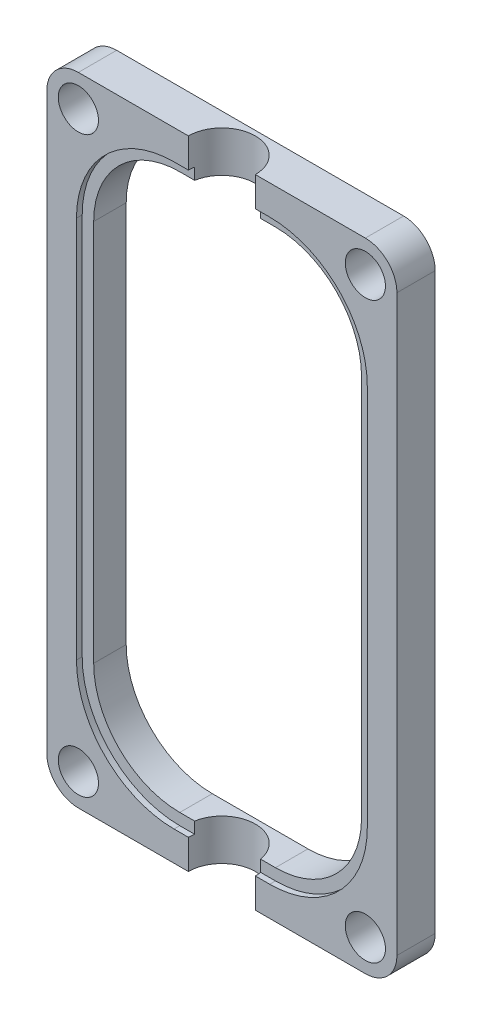
ISO-10303-21;
HEADER;
FILE_DESCRIPTION(('STEP AP214'),'2;1');
FILE_NAME('part.step','',(''),(''),'','','');
FILE_SCHEMA(('AUTOMOTIVE_DESIGN { 1 0 10303 214 1 1 1 1 }'));
ENDSEC;
DATA;
#1=APPLICATION_CONTEXT('core data for automotive mechanical design processes');
#2=APPLICATION_PROTOCOL_DEFINITION('international standard','automotive_design',2000,#1);
#3=PRODUCT_CONTEXT('',#1,'mechanical');
#4=PRODUCT('Part','Part','',(#3));
#5=PRODUCT_RELATED_PRODUCT_CATEGORY('part','',(#4));
#6=PRODUCT_DEFINITION_FORMATION('','',#4);
#7=PRODUCT_DEFINITION_CONTEXT('part definition',#1,'design');
#8=PRODUCT_DEFINITION('design','',#6,#7);
#9=PRODUCT_DEFINITION_SHAPE('','',#8);
#10=(LENGTH_UNIT() NAMED_UNIT(*) SI_UNIT(.MILLI.,.METRE.));
#11=(NAMED_UNIT(*) PLANE_ANGLE_UNIT() SI_UNIT($,.RADIAN.));
#12=(NAMED_UNIT(*) SI_UNIT($,.STERADIAN.) SOLID_ANGLE_UNIT());
#13=UNCERTAINTY_MEASURE_WITH_UNIT(LENGTH_MEASURE(1.E-05),#10,'distance_accuracy_value','');
#14=(GEOMETRIC_REPRESENTATION_CONTEXT(3) GLOBAL_UNCERTAINTY_ASSIGNED_CONTEXT((#13)) GLOBAL_UNIT_ASSIGNED_CONTEXT((#10,
#11,#12)) REPRESENTATION_CONTEXT('',''));
#15=CARTESIAN_POINT('',(0.,0.,0.));
#16=DIRECTION('',(0.,0.,1.));
#17=DIRECTION('',(1.,0.,0.));
#18=AXIS2_PLACEMENT_3D('',#15,#16,#17);
#19=CARTESIAN_POINT('',(-7.5,-15.,2.));
#20=DIRECTION('',(0.,0.,1.));
#21=DIRECTION('',(1.,0.,0.));
#22=AXIS2_PLACEMENT_3D('',#19,#20,#21);
#23=PLANE('',#22);
#24=CARTESIAN_POINT('',(7.5,-15.,2.));
#25=DIRECTION('',(0.,0.,1.));
#26=DIRECTION('',(1.,0.,0.));
#27=AXIS2_PLACEMENT_3D('',#24,#25,#26);
#28=CIRCLE('',#27,1.05);
#29=CARTESIAN_POINT('',(8.55,-15.,2.));
#30=VERTEX_POINT('',#29);
#31=EDGE_CURVE('E441',#30,#30,#28,.T.);
#32=ORIENTED_EDGE('',*,*,#31,.F.);
#33=EDGE_LOOP('',(#32));
#34=FACE_BOUND('',#33,.T.);
#35=CARTESIAN_POINT('',(7.5,15.,2.));
#36=DIRECTION('',(0.,0.,1.));
#37=DIRECTION('',(1.,0.,0.));
#38=AXIS2_PLACEMENT_3D('',#35,#36,#37);
#39=CIRCLE('',#38,1.05);
#40=CARTESIAN_POINT('',(8.55,15.,2.));
#41=VERTEX_POINT('',#40);
#42=EDGE_CURVE('E450',#41,#41,#39,.T.);
#43=ORIENTED_EDGE('',*,*,#42,.F.);
#44=EDGE_LOOP('',(#43));
#45=FACE_BOUND('',#44,.T.);
#46=DIRECTION('',(-1.,0.,0.));
#47=VECTOR('',#46,1.);
#48=CARTESIAN_POINT('',(7.5,16.65,2.));
#49=LINE('',#48,#47);
#50=CARTESIAN_POINT('',(7.5,16.65,2.));
#51=VERTEX_POINT('',#50);
#52=CARTESIAN_POINT('',(1.75,16.65,2.));
#53=VERTEX_POINT('',#52);
#54=EDGE_CURVE('E285',#51,#53,#49,.T.);
#55=ORIENTED_EDGE('',*,*,#54,.T.);
#56=DIRECTION('',(0.,-1.,0.));
#57=VECTOR('',#56,1.);
#58=CARTESIAN_POINT('',(1.75,20.5631189606246,2.));
#59=LINE('',#58,#57);
#60=CARTESIAN_POINT('',(1.75,15.1,2.));
#61=VERTEX_POINT('',#60);
#62=EDGE_CURVE('E262',#53,#61,#59,.T.);
#63=ORIENTED_EDGE('',*,*,#62,.T.);
#64=DIRECTION('',(-1.,0.,0.));
#65=VECTOR('',#64,1.);
#66=CARTESIAN_POINT('',(2.5,15.1,2.));
#67=LINE('',#66,#65);
#68=CARTESIAN_POINT('',(2.5,15.1,2.));
#69=VERTEX_POINT('',#68);
#70=EDGE_CURVE('E395',#69,#61,#67,.T.);
#71=ORIENTED_EDGE('',*,*,#70,.F.);
#72=CARTESIAN_POINT('',(2.5,10.,2.));
#73=DIRECTION('',(0.,0.,1.));
#74=DIRECTION('',(1.,0.,0.));
#75=AXIS2_PLACEMENT_3D('',#72,#73,#74);
#76=CIRCLE('',#75,5.1);
#77=CARTESIAN_POINT('',(7.6,10.,2.));
#78=VERTEX_POINT('',#77);
#79=EDGE_CURVE('E391',#78,#69,#76,.T.);
#80=ORIENTED_EDGE('',*,*,#79,.F.);
#81=DIRECTION('',(0.,1.,0.));
#82=VECTOR('',#81,1.);
#83=CARTESIAN_POINT('',(7.6,-10.,2.));
#84=LINE('',#83,#82);
#85=CARTESIAN_POINT('',(7.6,-10.,2.));
#86=VERTEX_POINT('',#85);
#87=EDGE_CURVE('E389',#86,#78,#84,.T.);
#88=ORIENTED_EDGE('',*,*,#87,.F.);
#89=CARTESIAN_POINT('',(2.5,-10.,2.));
#90=DIRECTION('',(0.,0.,1.));
#91=DIRECTION('',(1.,0.,0.));
#92=AXIS2_PLACEMENT_3D('',#89,#90,#91);
#93=CIRCLE('',#92,5.1);
#94=CARTESIAN_POINT('',(2.5,-15.1,2.));
#95=VERTEX_POINT('',#94);
#96=EDGE_CURVE('E384',#95,#86,#93,.T.);
#97=ORIENTED_EDGE('',*,*,#96,.F.);
#98=DIRECTION('',(1.,0.,0.));
#99=VECTOR('',#98,1.);
#100=CARTESIAN_POINT('',(-2.5,-15.1,2.));
#101=LINE('',#100,#99);
#102=CARTESIAN_POINT('',(1.75,-15.1,2.));
#103=VERTEX_POINT('',#102);
#104=EDGE_CURVE('E263',#103,#95,#101,.T.);
#105=ORIENTED_EDGE('',*,*,#104,.F.);
#106=CARTESIAN_POINT('',(1.75,-16.65,2.));
#107=VERTEX_POINT('',#106);
#108=EDGE_CURVE('E246',#103,#107,#59,.T.);
#109=ORIENTED_EDGE('',*,*,#108,.T.);
#110=DIRECTION('',(1.,0.,0.));
#111=VECTOR('',#110,1.);
#112=CARTESIAN_POINT('',(-7.5,-16.65,2.));
#113=LINE('',#112,#111);
#114=CARTESIAN_POINT('',(7.5,-16.65,2.));
#115=VERTEX_POINT('',#114);
#116=EDGE_CURVE('E257',#107,#115,#113,.T.);
#117=ORIENTED_EDGE('',*,*,#116,.T.);
#118=CARTESIAN_POINT('',(7.5,-15.,2.));
#119=DIRECTION('',(0.,0.,1.));
#120=DIRECTION('',(1.,0.,0.));
#121=AXIS2_PLACEMENT_3D('',#118,#119,#120);
#122=CIRCLE('',#121,1.65);
#123=CARTESIAN_POINT('',(9.15,-15.,2.));
#124=VERTEX_POINT('',#123);
#125=EDGE_CURVE('E272',#115,#124,#122,.T.);
#126=ORIENTED_EDGE('',*,*,#125,.T.);
#127=DIRECTION('',(0.,1.,0.));
#128=VECTOR('',#127,1.);
#129=CARTESIAN_POINT('',(9.15,-15.,2.));
#130=LINE('',#129,#128);
#131=CARTESIAN_POINT('',(9.15,15.,2.));
#132=VERTEX_POINT('',#131);
#133=EDGE_CURVE('E278',#124,#132,#130,.T.);
#134=ORIENTED_EDGE('',*,*,#133,.T.);
#135=CARTESIAN_POINT('',(7.5,15.,2.));
#136=DIRECTION('',(0.,0.,1.));
#137=DIRECTION('',(1.,0.,0.));
#138=AXIS2_PLACEMENT_3D('',#135,#136,#137);
#139=CIRCLE('',#138,1.65);
#140=EDGE_CURVE('E282',#132,#51,#139,.T.);
#141=ORIENTED_EDGE('',*,*,#140,.T.);
#142=EDGE_LOOP('',(#55,#63,#71,#80,#88,#97,#105,#109,#117,#126,#134,#141));
#143=FACE_BOUND('',#142,.T.);
#144=ADVANCED_FACE('F41',(#34,#45,#143),#23,.T.);
#145=CARTESIAN_POINT('',(-7.5,-16.65,2.));
#146=DIRECTION('',(0.,1.,0.));
#147=DIRECTION('',(0.,0.,1.));
#148=AXIS2_PLACEMENT_3D('',#145,#146,#147);
#149=PLANE('',#148);
#150=CARTESIAN_POINT('',(0.,-16.65,2.));
#151=DIRECTION('',(0.,-1.,0.));
#152=DIRECTION('',(0.,0.,-1.));
#153=AXIS2_PLACEMENT_3D('',#150,#151,#152);
#154=CIRCLE('',#153,1.75);
#155=CARTESIAN_POINT('',(-1.75,-16.65,2.));
#156=VERTEX_POINT('',#155);
#157=EDGE_CURVE('E249',#156,#107,#154,.T.);
#158=ORIENTED_EDGE('',*,*,#157,.F.);
#159=CARTESIAN_POINT('',(-7.5,-16.65,2.));
#160=VERTEX_POINT('',#159);
#161=EDGE_CURVE('E269',#160,#156,#113,.T.);
#162=ORIENTED_EDGE('',*,*,#161,.F.);
#163=DIRECTION('',(0.,0.,-1.));
#164=VECTOR('',#163,1.);
#165=CARTESIAN_POINT('',(-7.5,-16.65,2.));
#166=LINE('',#165,#164);
#167=CARTESIAN_POINT('',(-7.5,-16.65,0.));
#168=VERTEX_POINT('',#167);
#169=EDGE_CURVE('E330',#160,#168,#166,.T.);
#170=ORIENTED_EDGE('',*,*,#169,.T.);
#171=DIRECTION('',(1.,0.,0.));
#172=VECTOR('',#171,1.);
#173=CARTESIAN_POINT('',(-7.5,-16.65,0.));
#174=LINE('',#173,#172);
#175=CARTESIAN_POINT('',(7.5,-16.65,0.));
#176=VERTEX_POINT('',#175);
#177=EDGE_CURVE('E293',#168,#176,#174,.T.);
#178=ORIENTED_EDGE('',*,*,#177,.T.);
#179=DIRECTION('',(0.,0.,-1.));
#180=VECTOR('',#179,1.);
#181=CARTESIAN_POINT('',(7.5,-16.65,2.));
#182=LINE('',#181,#180);
#183=EDGE_CURVE('E268',#115,#176,#182,.T.);
#184=ORIENTED_EDGE('',*,*,#183,.F.);
#185=ORIENTED_EDGE('',*,*,#116,.F.);
#186=EDGE_LOOP('',(#158,#162,#170,#178,#184,#185));
#187=FACE_BOUND('',#186,.T.);
#188=ADVANCED_FACE('F266',(#187),#149,.F.);
#189=CARTESIAN_POINT('',(7.5,16.65,2.));
#190=DIRECTION('',(0.,-1.,0.));
#191=DIRECTION('',(0.,0.,-1.));
#192=AXIS2_PLACEMENT_3D('',#189,#190,#191);
#193=PLANE('',#192);
#194=CARTESIAN_POINT('',(0.,16.65,2.));
#195=DIRECTION('',(0.,-1.,0.));
#196=DIRECTION('',(0.,0.,-1.));
#197=AXIS2_PLACEMENT_3D('',#194,#195,#196);
#198=CIRCLE('',#197,1.75);
#199=CARTESIAN_POINT('',(-1.75,16.65,2.));
#200=VERTEX_POINT('',#199);
#201=EDGE_CURVE('E553',#53,#200,#198,.F.);
#202=ORIENTED_EDGE('',*,*,#201,.F.);
#203=ORIENTED_EDGE('',*,*,#54,.F.);
#204=DIRECTION('',(0.,0.,-1.));
#205=VECTOR('',#204,1.);
#206=CARTESIAN_POINT('',(7.5,16.65,2.));
#207=LINE('',#206,#205);
#208=CARTESIAN_POINT('',(7.5,16.65,0.));
#209=VERTEX_POINT('',#208);
#210=EDGE_CURVE('E320',#51,#209,#207,.T.);
#211=ORIENTED_EDGE('',*,*,#210,.T.);
#212=DIRECTION('',(-1.,0.,0.));
#213=VECTOR('',#212,1.);
#214=CARTESIAN_POINT('',(7.5,16.65,0.));
#215=LINE('',#214,#213);
#216=CARTESIAN_POINT('',(-7.5,16.65,0.));
#217=VERTEX_POINT('',#216);
#218=EDGE_CURVE('E305',#209,#217,#215,.T.);
#219=ORIENTED_EDGE('',*,*,#218,.T.);
#220=DIRECTION('',(0.,0.,-1.));
#221=VECTOR('',#220,1.);
#222=CARTESIAN_POINT('',(-7.5,16.65,2.));
#223=LINE('',#222,#221);
#224=CARTESIAN_POINT('',(-7.5,16.65,2.));
#225=VERTEX_POINT('',#224);
#226=EDGE_CURVE('E314',#225,#217,#223,.T.);
#227=ORIENTED_EDGE('',*,*,#226,.F.);
#228=EDGE_CURVE('E283',#200,#225,#49,.T.);
#229=ORIENTED_EDGE('',*,*,#228,.F.);
#230=EDGE_LOOP('',(#202,#203,#211,#219,#227,#229));
#231=FACE_BOUND('',#230,.T.);
#232=ADVANCED_FACE('F595',(#231),#193,.F.);
#233=CARTESIAN_POINT('',(2.5,15.1,1.7));
#234=DIRECTION('',(0.,1.,0.));
#235=DIRECTION('',(0.,0.,1.));
#236=AXIS2_PLACEMENT_3D('',#233,#234,#235);
#237=PLANE('',#236);
#238=ORIENTED_EDGE('',*,*,#70,.T.);
#239=CARTESIAN_POINT('',(0.,15.1,2.));
#240=DIRECTION('',(0.,1.,0.));
#241=DIRECTION('',(0.,0.,1.));
#242=AXIS2_PLACEMENT_3D('',#239,#240,#241);
#243=CIRCLE('',#242,1.75);
#244=CARTESIAN_POINT('',(1.72409396495667,15.1,1.7));
#245=VERTEX_POINT('',#244);
#246=EDGE_CURVE('E558',#61,#245,#243,.T.);
#247=ORIENTED_EDGE('',*,*,#246,.T.);
#248=DIRECTION('',(-1.,0.,0.));
#249=VECTOR('',#248,1.);
#250=CARTESIAN_POINT('',(2.5,15.1,1.7));
#251=LINE('',#250,#249);
#252=CARTESIAN_POINT('',(2.5,15.1,1.7));
#253=VERTEX_POINT('',#252);
#254=EDGE_CURVE('E372',#253,#245,#251,.T.);
#255=ORIENTED_EDGE('',*,*,#254,.F.);
#256=DIRECTION('',(0.,0.,1.));
#257=VECTOR('',#256,1.);
#258=CARTESIAN_POINT('',(2.5,15.1,1.7));
#259=LINE('',#258,#257);
#260=EDGE_CURVE('E414',#253,#69,#259,.T.);
#261=ORIENTED_EDGE('',*,*,#260,.T.);
#262=EDGE_LOOP('',(#238,#247,#255,#261));
#263=FACE_BOUND('',#262,.T.);
#264=ADVANCED_FACE('F581',(#263),#237,.F.);
#265=CARTESIAN_POINT('',(-2.5,-15.1,1.7));
#266=DIRECTION('',(0.,-1.,0.));
#267=DIRECTION('',(0.,0.,-1.));
#268=AXIS2_PLACEMENT_3D('',#265,#266,#267);
#269=PLANE('',#268);
#270=DIRECTION('',(1.,0.,0.));
#271=VECTOR('',#270,1.);
#272=CARTESIAN_POINT('',(-2.5,-15.1,1.7));
#273=LINE('',#272,#271);
#274=CARTESIAN_POINT('',(1.72409396495667,-15.1,1.7));
#275=VERTEX_POINT('',#274);
#276=CARTESIAN_POINT('',(2.5,-15.1,1.7));
#277=VERTEX_POINT('',#276);
#278=EDGE_CURVE('E356',#275,#277,#273,.T.);
#279=ORIENTED_EDGE('',*,*,#278,.F.);
#280=CARTESIAN_POINT('',(0.,-15.1,2.));
#281=DIRECTION('',(0.,-1.,0.));
#282=DIRECTION('',(0.,0.,-1.));
#283=AXIS2_PLACEMENT_3D('',#280,#281,#282);
#284=CIRCLE('',#283,1.75);
#285=EDGE_CURVE('E57',#275,#103,#284,.T.);
#286=ORIENTED_EDGE('',*,*,#285,.T.);
#287=ORIENTED_EDGE('',*,*,#104,.T.);
#288=DIRECTION('',(0.,0.,1.));
#289=VECTOR('',#288,1.);
#290=CARTESIAN_POINT('',(2.5,-15.1,1.7));
#291=LINE('',#290,#289);
#292=EDGE_CURVE('E416',#277,#95,#291,.T.);
#293=ORIENTED_EDGE('',*,*,#292,.F.);
#294=EDGE_LOOP('',(#279,#286,#287,#293));
#295=FACE_BOUND('',#294,.T.);
#296=ADVANCED_FACE('F562',(#295),#269,.F.);
#297=CARTESIAN_POINT('',(-2.5,-10.,1.7));
#298=DIRECTION('',(0.,0.,1.));
#299=DIRECTION('',(1.,0.,0.));
#300=AXIS2_PLACEMENT_3D('',#297,#298,#299);
#301=PLANE('',#300);
#302=DIRECTION('',(0.,-1.,0.));
#303=VECTOR('',#302,1.);
#304=CARTESIAN_POINT('',(-1.72409396495667,20.5631189606246,1.7));
#305=LINE('',#304,#303);
#306=CARTESIAN_POINT('',(-1.72409396495667,15.1,1.7));
#307=VERTEX_POINT('',#306);
#308=CARTESIAN_POINT('',(-1.72409396495667,14.5,1.7));
#309=VERTEX_POINT('',#308);
#310=EDGE_CURVE('E11',#307,#309,#305,.T.);
#311=ORIENTED_EDGE('',*,*,#310,.F.);
#312=CARTESIAN_POINT('',(-2.5,15.1,1.7));
#313=VERTEX_POINT('',#312);
#314=EDGE_CURVE('E373',#307,#313,#251,.T.);
#315=ORIENTED_EDGE('',*,*,#314,.T.);
#316=CARTESIAN_POINT('',(-2.5,10.,1.7));
#317=DIRECTION('',(0.,0.,1.));
#318=DIRECTION('',(1.,0.,0.));
#319=AXIS2_PLACEMENT_3D('',#316,#317,#318);
#320=CIRCLE('',#319,5.1);
#321=CARTESIAN_POINT('',(-7.6,10.,1.7));
#322=VERTEX_POINT('',#321);
#323=EDGE_CURVE('E380',#313,#322,#320,.T.);
#324=ORIENTED_EDGE('',*,*,#323,.T.);
#325=DIRECTION('',(0.,-1.,0.));
#326=VECTOR('',#325,1.);
#327=CARTESIAN_POINT('',(-7.6,10.,1.7));
#328=LINE('',#327,#326);
#329=CARTESIAN_POINT('',(-7.6,-10.,1.7));
#330=VERTEX_POINT('',#329);
#331=EDGE_CURVE('E379',#322,#330,#328,.T.);
#332=ORIENTED_EDGE('',*,*,#331,.T.);
#333=CARTESIAN_POINT('',(-2.5,-10.,1.7));
#334=DIRECTION('',(0.,0.,1.));
#335=DIRECTION('',(1.,0.,0.));
#336=AXIS2_PLACEMENT_3D('',#333,#334,#335);
#337=CIRCLE('',#336,5.1);
#338=CARTESIAN_POINT('',(-2.5,-15.1,1.7));
#339=VERTEX_POINT('',#338);
#340=EDGE_CURVE('E357',#330,#339,#337,.T.);
#341=ORIENTED_EDGE('',*,*,#340,.T.);
#342=CARTESIAN_POINT('',(-1.72409396495667,-15.1,1.7));
#343=VERTEX_POINT('',#342);
#344=EDGE_CURVE('E346',#339,#343,#273,.T.);
#345=ORIENTED_EDGE('',*,*,#344,.T.);
#346=CARTESIAN_POINT('',(-1.72409396495667,-14.5,1.7));
#347=VERTEX_POINT('',#346);
#348=EDGE_CURVE('E44',#347,#343,#305,.T.);
#349=ORIENTED_EDGE('',*,*,#348,.F.);
#350=DIRECTION('',(1.,0.,0.));
#351=VECTOR('',#350,1.);
#352=CARTESIAN_POINT('',(-2.5,-14.5,1.7));
#353=LINE('',#352,#351);
#354=CARTESIAN_POINT('',(-2.5,-14.5,1.7));
#355=VERTEX_POINT('',#354);
#356=EDGE_CURVE('E437',#355,#347,#353,.T.);
#357=ORIENTED_EDGE('',*,*,#356,.F.);
#358=CARTESIAN_POINT('',(-2.5,-10.,1.7));
#359=DIRECTION('',(0.,0.,1.));
#360=DIRECTION('',(1.,0.,0.));
#361=AXIS2_PLACEMENT_3D('',#358,#359,#360);
#362=CIRCLE('',#361,4.5);
#363=CARTESIAN_POINT('',(-7.,-10.,1.7));
#364=VERTEX_POINT('',#363);
#365=EDGE_CURVE('E439',#364,#355,#362,.T.);
#366=ORIENTED_EDGE('',*,*,#365,.F.);
#367=DIRECTION('',(0.,-1.,0.));
#368=VECTOR('',#367,1.);
#369=CARTESIAN_POINT('',(-7.,10.,1.7));
#370=LINE('',#369,#368);
#371=CARTESIAN_POINT('',(-7.,10.,1.7));
#372=VERTEX_POINT('',#371);
#373=EDGE_CURVE('E329',#372,#364,#370,.T.);
#374=ORIENTED_EDGE('',*,*,#373,.F.);
#375=CARTESIAN_POINT('',(-2.5,10.,1.7));
#376=DIRECTION('',(0.,0.,1.));
#377=DIRECTION('',(1.,0.,0.));
#378=AXIS2_PLACEMENT_3D('',#375,#376,#377);
#379=CIRCLE('',#378,4.5);
#380=CARTESIAN_POINT('',(-2.5,14.5,1.7));
#381=VERTEX_POINT('',#380);
#382=EDGE_CURVE('E406',#381,#372,#379,.T.);
#383=ORIENTED_EDGE('',*,*,#382,.F.);
#384=DIRECTION('',(-1.,0.,0.));
#385=VECTOR('',#384,1.);
#386=CARTESIAN_POINT('',(2.5,14.5,1.7));
#387=LINE('',#386,#385);
#388=EDGE_CURVE('E424',#309,#381,#387,.T.);
#389=ORIENTED_EDGE('',*,*,#388,.F.);
#390=EDGE_LOOP('',(#311,#315,#324,#332,#341,#345,#349,#357,#366,#374,#383,#389));
#391=FACE_BOUND('',#390,.T.);
#392=ADVANCED_FACE('F355',(#391),#301,.T.);
#393=CARTESIAN_POINT('',(-2.5,-10.,2.));
#394=DIRECTION('',(0.,0.,-1.));
#395=DIRECTION('',(-1.,0.,0.));
#396=AXIS2_PLACEMENT_3D('',#393,#394,#395);
#397=CYLINDRICAL_SURFACE('',#396,4.5);
#398=DIRECTION('',(0.,0.,-1.));
#399=VECTOR('',#398,1.);
#400=CARTESIAN_POINT('',(-7.,-10.,2.));
#401=LINE('',#400,#399);
#402=CARTESIAN_POINT('',(-7.,-10.,0.));
#403=VERTEX_POINT('',#402);
#404=EDGE_CURVE('E491',#364,#403,#401,.T.);
#405=ORIENTED_EDGE('',*,*,#404,.F.);
#406=ORIENTED_EDGE('',*,*,#365,.T.);
#407=DIRECTION('',(0.,0.,-1.));
#408=VECTOR('',#407,1.);
#409=CARTESIAN_POINT('',(-2.5,-14.5,2.));
#410=LINE('',#409,#408);
#411=CARTESIAN_POINT('',(-2.5,-14.5,0.));
#412=VERTEX_POINT('',#411);
#413=EDGE_CURVE('E296',#355,#412,#410,.T.);
#414=ORIENTED_EDGE('',*,*,#413,.T.);
#415=CARTESIAN_POINT('',(-2.5,-10.,0.));
#416=DIRECTION('',(0.,0.,1.));
#417=DIRECTION('',(1.,0.,0.));
#418=AXIS2_PLACEMENT_3D('',#415,#416,#417);
#419=CIRCLE('',#418,4.5);
#420=EDGE_CURVE('E465',#403,#412,#419,.T.);
#421=ORIENTED_EDGE('',*,*,#420,.F.);
#422=EDGE_LOOP('',(#405,#406,#414,#421));
#423=FACE_BOUND('',#422,.T.);
#424=ADVANCED_FACE('F510',(#423),#397,.F.);
#425=CARTESIAN_POINT('',(-2.5,-14.5,2.));
#426=DIRECTION('',(0.,1.,0.));
#427=DIRECTION('',(0.,0.,1.));
#428=AXIS2_PLACEMENT_3D('',#425,#426,#427);
#429=PLANE('',#428);
#430=CARTESIAN_POINT('',(0.,-14.5,2.));
#431=DIRECTION('',(0.,1.,0.));
#432=DIRECTION('',(0.,0.,1.));
#433=AXIS2_PLACEMENT_3D('',#430,#431,#432);
#434=CIRCLE('',#433,1.75);
#435=CARTESIAN_POINT('',(1.72409396495667,-14.5,1.7));
#436=VERTEX_POINT('',#435);
#437=EDGE_CURVE('E338',#436,#347,#434,.T.);
#438=ORIENTED_EDGE('',*,*,#437,.F.);
#439=CARTESIAN_POINT('',(2.5,-14.5,1.7));
#440=VERTEX_POINT('',#439);
#441=EDGE_CURVE('E440',#436,#440,#353,.T.);
#442=ORIENTED_EDGE('',*,*,#441,.T.);
#443=DIRECTION('',(0.,0.,-1.));
#444=VECTOR('',#443,1.);
#445=CARTESIAN_POINT('',(2.5,-14.5,2.));
#446=LINE('',#445,#444);
#447=CARTESIAN_POINT('',(2.5,-14.5,0.));
#448=VERTEX_POINT('',#447);
#449=EDGE_CURVE('E504',#440,#448,#446,.T.);
#450=ORIENTED_EDGE('',*,*,#449,.T.);
#451=DIRECTION('',(1.,0.,0.));
#452=VECTOR('',#451,1.);
#453=CARTESIAN_POINT('',(-2.5,-14.5,0.));
#454=LINE('',#453,#452);
#455=EDGE_CURVE('E466',#412,#448,#454,.T.);
#456=ORIENTED_EDGE('',*,*,#455,.F.);
#457=ORIENTED_EDGE('',*,*,#413,.F.);
#458=ORIENTED_EDGE('',*,*,#356,.T.);
#459=EDGE_LOOP('',(#438,#442,#450,#456,#457,#458));
#460=FACE_BOUND('',#459,.T.);
#461=ADVANCED_FACE('F512',(#460),#429,.T.);
#462=CARTESIAN_POINT('',(2.5,-10.,2.));
#463=DIRECTION('',(0.,0.,-1.));
#464=DIRECTION('',(-1.,0.,0.));
#465=AXIS2_PLACEMENT_3D('',#462,#463,#464);
#466=CYLINDRICAL_SURFACE('',#465,4.5);
#467=ORIENTED_EDGE('',*,*,#449,.F.);
#468=CARTESIAN_POINT('',(2.5,-10.,1.7));
#469=DIRECTION('',(0.,0.,1.));
#470=DIRECTION('',(1.,0.,0.));
#471=AXIS2_PLACEMENT_3D('',#468,#469,#470);
#472=CIRCLE('',#471,4.5);
#473=CARTESIAN_POINT('',(7.,-10.,1.7));
#474=VERTEX_POINT('',#473);
#475=EDGE_CURVE('E432',#440,#474,#472,.T.);
#476=ORIENTED_EDGE('',*,*,#475,.T.);
#477=DIRECTION('',(0.,0.,-1.));
#478=VECTOR('',#477,1.);
#479=CARTESIAN_POINT('',(7.,-10.,2.));
#480=LINE('',#479,#478);
#481=CARTESIAN_POINT('',(7.,-10.,0.));
#482=VERTEX_POINT('',#481);
#483=EDGE_CURVE('E501',#474,#482,#480,.T.);
#484=ORIENTED_EDGE('',*,*,#483,.T.);
#485=CARTESIAN_POINT('',(2.5,-10.,0.));
#486=DIRECTION('',(0.,0.,1.));
#487=DIRECTION('',(1.,0.,0.));
#488=AXIS2_PLACEMENT_3D('',#485,#486,#487);
#489=CIRCLE('',#488,4.5);
#490=EDGE_CURVE('E471',#448,#482,#489,.T.);
#491=ORIENTED_EDGE('',*,*,#490,.F.);
#492=EDGE_LOOP('',(#467,#476,#484,#491));
#493=FACE_BOUND('',#492,.T.);
#494=ADVANCED_FACE('F572',(#493),#466,.F.);
#495=CARTESIAN_POINT('',(7.,-10.,2.));
#496=DIRECTION('',(-1.,0.,0.));
#497=DIRECTION('',(0.,0.,1.));
#498=AXIS2_PLACEMENT_3D('',#495,#496,#497);
#499=PLANE('',#498);
#500=ORIENTED_EDGE('',*,*,#483,.F.);
#501=DIRECTION('',(0.,1.,0.));
#502=VECTOR('',#501,1.);
#503=CARTESIAN_POINT('',(7.,-10.,1.7));
#504=LINE('',#503,#502);
#505=CARTESIAN_POINT('',(7.,10.,1.7));
#506=VERTEX_POINT('',#505);
#507=EDGE_CURVE('E431',#474,#506,#504,.T.);
#508=ORIENTED_EDGE('',*,*,#507,.T.);
#509=DIRECTION('',(0.,0.,-1.));
#510=VECTOR('',#509,1.);
#511=CARTESIAN_POINT('',(7.,10.,2.));
#512=LINE('',#511,#510);
#513=CARTESIAN_POINT('',(7.,10.,0.));
#514=VERTEX_POINT('',#513);
#515=EDGE_CURVE('E496',#506,#514,#512,.T.);
#516=ORIENTED_EDGE('',*,*,#515,.T.);
#517=DIRECTION('',(0.,1.,0.));
#518=VECTOR('',#517,1.);
#519=CARTESIAN_POINT('',(7.,-10.,0.));
#520=LINE('',#519,#518);
#521=EDGE_CURVE('E478',#482,#514,#520,.T.);
#522=ORIENTED_EDGE('',*,*,#521,.F.);
#523=EDGE_LOOP('',(#500,#508,#516,#522));
#524=FACE_BOUND('',#523,.T.);
#525=ADVANCED_FACE('F578',(#524),#499,.T.);
#526=CARTESIAN_POINT('',(2.5,10.,2.));
#527=DIRECTION('',(0.,0.,-1.));
#528=DIRECTION('',(-1.,0.,0.));
#529=AXIS2_PLACEMENT_3D('',#526,#527,#528);
#530=CYLINDRICAL_SURFACE('',#529,4.5);
#531=ORIENTED_EDGE('',*,*,#515,.F.);
#532=CARTESIAN_POINT('',(2.5,10.,1.7));
#533=DIRECTION('',(0.,0.,1.));
#534=DIRECTION('',(1.,0.,0.));
#535=AXIS2_PLACEMENT_3D('',#532,#533,#534);
#536=CIRCLE('',#535,4.5);
#537=CARTESIAN_POINT('',(2.5,14.5,1.7));
#538=VERTEX_POINT('',#537);
#539=EDGE_CURVE('E428',#506,#538,#536,.T.);
#540=ORIENTED_EDGE('',*,*,#539,.T.);
#541=DIRECTION('',(0.,0.,-1.));
#542=VECTOR('',#541,1.);
#543=CARTESIAN_POINT('',(2.5,14.5,2.));
#544=LINE('',#543,#542);
#545=CARTESIAN_POINT('',(2.5,14.5,0.));
#546=VERTEX_POINT('',#545);
#547=EDGE_CURVE('E500',#538,#546,#544,.T.);
#548=ORIENTED_EDGE('',*,*,#547,.T.);
#549=CARTESIAN_POINT('',(2.5,10.,0.));
#550=DIRECTION('',(0.,0.,1.));
#551=DIRECTION('',(1.,0.,0.));
#552=AXIS2_PLACEMENT_3D('',#549,#550,#551);
#553=CIRCLE('',#552,4.5);
#554=EDGE_CURVE('E479',#514,#546,#553,.T.);
#555=ORIENTED_EDGE('',*,*,#554,.F.);
#556=EDGE_LOOP('',(#531,#540,#548,#555));
#557=FACE_BOUND('',#556,.T.);
#558=ADVANCED_FACE('F580',(#557),#530,.F.);
#559=CARTESIAN_POINT('',(2.5,14.5,2.));
#560=DIRECTION('',(0.,-1.,0.));
#561=DIRECTION('',(0.,0.,-1.));
#562=AXIS2_PLACEMENT_3D('',#559,#560,#561);
#563=PLANE('',#562);
#564=CARTESIAN_POINT('',(0.,14.5,2.));
#565=DIRECTION('',(0.,-1.,0.));
#566=DIRECTION('',(0.,0.,-1.));
#567=AXIS2_PLACEMENT_3D('',#564,#565,#566);
#568=CIRCLE('',#567,1.75);
#569=CARTESIAN_POINT('',(1.72409396495667,14.5,1.7));
#570=VERTEX_POINT('',#569);
#571=EDGE_CURVE('E64',#309,#570,#568,.T.);
#572=ORIENTED_EDGE('',*,*,#571,.F.);
#573=ORIENTED_EDGE('',*,*,#388,.T.);
#574=DIRECTION('',(0.,0.,-1.));
#575=VECTOR('',#574,1.);
#576=CARTESIAN_POINT('',(-2.5,14.5,2.));
#577=LINE('',#576,#575);
#578=CARTESIAN_POINT('',(-2.5,14.5,0.));
#579=VERTEX_POINT('',#578);
#580=EDGE_CURVE('E494',#381,#579,#577,.T.);
#581=ORIENTED_EDGE('',*,*,#580,.T.);
#582=DIRECTION('',(-1.,0.,0.));
#583=VECTOR('',#582,1.);
#584=CARTESIAN_POINT('',(2.5,14.5,0.));
#585=LINE('',#584,#583);
#586=EDGE_CURVE('E485',#546,#579,#585,.T.);
#587=ORIENTED_EDGE('',*,*,#586,.F.);
#588=ORIENTED_EDGE('',*,*,#547,.F.);
#589=EDGE_CURVE('E422',#538,#570,#387,.T.);
#590=ORIENTED_EDGE('',*,*,#589,.T.);
#591=EDGE_LOOP('',(#572,#573,#581,#587,#588,#590));
#592=FACE_BOUND('',#591,.T.);
#593=ADVANCED_FACE('F530',(#592),#563,.T.);
#594=CARTESIAN_POINT('',(-2.5,10.,2.));
#595=DIRECTION('',(0.,0.,-1.));
#596=DIRECTION('',(-1.,0.,0.));
#597=AXIS2_PLACEMENT_3D('',#594,#595,#596);
#598=CYLINDRICAL_SURFACE('',#597,4.5);
#599=ORIENTED_EDGE('',*,*,#580,.F.);
#600=ORIENTED_EDGE('',*,*,#382,.T.);
#601=DIRECTION('',(0.,0.,-1.));
#602=VECTOR('',#601,1.);
#603=CARTESIAN_POINT('',(-7.,10.,2.));
#604=LINE('',#603,#602);
#605=CARTESIAN_POINT('',(-7.,10.,0.));
#606=VERTEX_POINT('',#605);
#607=EDGE_CURVE('E492',#372,#606,#604,.T.);
#608=ORIENTED_EDGE('',*,*,#607,.T.);
#609=CARTESIAN_POINT('',(-2.5,10.,0.));
#610=DIRECTION('',(0.,0.,1.));
#611=DIRECTION('',(1.,0.,0.));
#612=AXIS2_PLACEMENT_3D('',#609,#610,#611);
#613=CIRCLE('',#612,4.5);
#614=EDGE_CURVE('E484',#579,#606,#613,.T.);
#615=ORIENTED_EDGE('',*,*,#614,.F.);
#616=EDGE_LOOP('',(#599,#600,#608,#615));
#617=FACE_BOUND('',#616,.T.);
#618=ADVANCED_FACE('F528',(#617),#598,.F.);
#619=CARTESIAN_POINT('',(-7.,10.,2.));
#620=DIRECTION('',(1.,0.,0.));
#621=DIRECTION('',(0.,0.,-1.));
#622=AXIS2_PLACEMENT_3D('',#619,#620,#621);
#623=PLANE('',#622);
#624=ORIENTED_EDGE('',*,*,#607,.F.);
#625=ORIENTED_EDGE('',*,*,#373,.T.);
#626=ORIENTED_EDGE('',*,*,#404,.T.);
#627=DIRECTION('',(0.,-1.,0.));
#628=VECTOR('',#627,1.);
#629=CARTESIAN_POINT('',(-7.,10.,0.));
#630=LINE('',#629,#628);
#631=EDGE_CURVE('E488',#606,#403,#630,.T.);
#632=ORIENTED_EDGE('',*,*,#631,.F.);
#633=EDGE_LOOP('',(#624,#625,#626,#632));
#634=FACE_BOUND('',#633,.T.);
#635=ADVANCED_FACE('F523',(#634),#623,.T.);
#636=DIRECTION('',(0.,-1.,0.));
#637=VECTOR('',#636,1.);
#638=CARTESIAN_POINT('',(-1.75,20.5631189606246,2.));
#639=LINE('',#638,#637);
#640=CARTESIAN_POINT('',(-1.75,15.1,2.));
#641=VERTEX_POINT('',#640);
#642=EDGE_CURVE('E554',#200,#641,#639,.T.);
#643=ORIENTED_EDGE('',*,*,#642,.F.);
#644=ORIENTED_EDGE('',*,*,#228,.T.);
#645=CARTESIAN_POINT('',(-7.5,15.,2.));
#646=DIRECTION('',(0.,0.,1.));
#647=DIRECTION('',(1.,0.,0.));
#648=AXIS2_PLACEMENT_3D('',#645,#646,#647);
#649=CIRCLE('',#648,1.65);
#650=CARTESIAN_POINT('',(-9.15,15.,2.));
#651=VERTEX_POINT('',#650);
#652=EDGE_CURVE('E289',#225,#651,#649,.T.);
#653=ORIENTED_EDGE('',*,*,#652,.T.);
#654=DIRECTION('',(0.,-1.,0.));
#655=VECTOR('',#654,1.);
#656=CARTESIAN_POINT('',(-9.15,15.,2.));
#657=LINE('',#656,#655);
#658=CARTESIAN_POINT('',(-9.15,-15.,2.));
#659=VERTEX_POINT('',#658);
#660=EDGE_CURVE('E290',#651,#659,#657,.T.);
#661=ORIENTED_EDGE('',*,*,#660,.T.);
#662=CARTESIAN_POINT('',(-7.5,-15.,2.));
#663=DIRECTION('',(0.,0.,1.));
#664=DIRECTION('',(1.,0.,0.));
#665=AXIS2_PLACEMENT_3D('',#662,#663,#664);
#666=CIRCLE('',#665,1.65);
#667=EDGE_CURVE('E271',#659,#160,#666,.T.);
#668=ORIENTED_EDGE('',*,*,#667,.T.);
#669=ORIENTED_EDGE('',*,*,#161,.T.);
#670=CARTESIAN_POINT('',(-1.75,-15.1,2.));
#671=VERTEX_POINT('',#670);
#672=EDGE_CURVE('E252',#671,#156,#639,.T.);
#673=ORIENTED_EDGE('',*,*,#672,.F.);
#674=CARTESIAN_POINT('',(-2.5,-15.1,2.));
#675=VERTEX_POINT('',#674);
#676=EDGE_CURVE('E351',#675,#671,#101,.T.);
#677=ORIENTED_EDGE('',*,*,#676,.F.);
#678=CARTESIAN_POINT('',(-2.5,-10.,2.));
#679=DIRECTION('',(0.,0.,1.));
#680=DIRECTION('',(1.,0.,0.));
#681=AXIS2_PLACEMENT_3D('',#678,#679,#680);
#682=CIRCLE('',#681,5.1);
#683=CARTESIAN_POINT('',(-7.6,-10.,2.));
#684=VERTEX_POINT('',#683);
#685=EDGE_CURVE('E352',#684,#675,#682,.T.);
#686=ORIENTED_EDGE('',*,*,#685,.F.);
#687=DIRECTION('',(0.,-1.,0.));
#688=VECTOR('',#687,1.);
#689=CARTESIAN_POINT('',(-7.6,10.,2.));
#690=LINE('',#689,#688);
#691=CARTESIAN_POINT('',(-7.6,10.,2.));
#692=VERTEX_POINT('',#691);
#693=EDGE_CURVE('E402',#692,#684,#690,.T.);
#694=ORIENTED_EDGE('',*,*,#693,.F.);
#695=CARTESIAN_POINT('',(-2.5,10.,2.));
#696=DIRECTION('',(0.,0.,1.));
#697=DIRECTION('',(1.,0.,0.));
#698=AXIS2_PLACEMENT_3D('',#695,#696,#697);
#699=CIRCLE('',#698,5.1);
#700=CARTESIAN_POINT('',(-2.5,15.1,2.));
#701=VERTEX_POINT('',#700);
#702=EDGE_CURVE('E397',#701,#692,#699,.T.);
#703=ORIENTED_EDGE('',*,*,#702,.F.);
#704=EDGE_CURVE('E393',#641,#701,#67,.T.);
#705=ORIENTED_EDGE('',*,*,#704,.F.);
#706=EDGE_LOOP('',(#643,#644,#653,#661,#668,#669,#673,#677,#686,#694,#703,#705));
#707=FACE_BOUND('',#706,.T.);
#708=CARTESIAN_POINT('',(-7.5,15.,2.));
#709=DIRECTION('',(0.,0.,1.));
#710=DIRECTION('',(1.,0.,0.));
#711=AXIS2_PLACEMENT_3D('',#708,#709,#710);
#712=CIRCLE('',#711,1.05);
#713=CARTESIAN_POINT('',(-6.45,15.,2.));
#714=VERTEX_POINT('',#713);
#715=EDGE_CURVE('E462',#714,#714,#712,.T.);
#716=ORIENTED_EDGE('',*,*,#715,.F.);
#717=EDGE_LOOP('',(#716));
#718=FACE_BOUND('',#717,.T.);
#719=CARTESIAN_POINT('',(-7.5,-15.,2.));
#720=DIRECTION('',(0.,0.,1.));
#721=DIRECTION('',(1.,0.,0.));
#722=AXIS2_PLACEMENT_3D('',#719,#720,#721);
#723=CIRCLE('',#722,1.05);
#724=CARTESIAN_POINT('',(-6.45,-15.,2.));
#725=VERTEX_POINT('',#724);
#726=EDGE_CURVE('E457',#725,#725,#723,.T.);
#727=ORIENTED_EDGE('',*,*,#726,.F.);
#728=EDGE_LOOP('',(#727));
#729=FACE_BOUND('',#728,.T.);
#730=ADVANCED_FACE('F552',(#707,#718,#729),#23,.T.);
#731=CARTESIAN_POINT('',(-7.5,-15.,0.));
#732=DIRECTION('',(0.,0.,1.));
#733=DIRECTION('',(1.,0.,0.));
#734=AXIS2_PLACEMENT_3D('',#731,#732,#733);
#735=PLANE('',#734);
#736=CARTESIAN_POINT('',(-7.5,-15.,0.));
#737=DIRECTION('',(0.,0.,1.));
#738=DIRECTION('',(1.,0.,0.));
#739=AXIS2_PLACEMENT_3D('',#736,#737,#738);
#740=CIRCLE('',#739,1.65);
#741=CARTESIAN_POINT('',(-9.15,-15.,0.));
#742=VERTEX_POINT('',#741);
#743=EDGE_CURVE('E295',#742,#168,#740,.T.);
#744=ORIENTED_EDGE('',*,*,#743,.F.);
#745=DIRECTION('',(0.,-1.,0.));
#746=VECTOR('',#745,1.);
#747=CARTESIAN_POINT('',(-9.15,15.,0.));
#748=LINE('',#747,#746);
#749=CARTESIAN_POINT('',(-9.15,15.,0.));
#750=VERTEX_POINT('',#749);
#751=EDGE_CURVE('E274',#750,#742,#748,.T.);
#752=ORIENTED_EDGE('',*,*,#751,.F.);
#753=CARTESIAN_POINT('',(-7.5,15.,0.));
#754=DIRECTION('',(0.,0.,1.));
#755=DIRECTION('',(1.,0.,0.));
#756=AXIS2_PLACEMENT_3D('',#753,#754,#755);
#757=CIRCLE('',#756,1.65);
#758=EDGE_CURVE('E308',#217,#750,#757,.T.);
#759=ORIENTED_EDGE('',*,*,#758,.F.);
#760=ORIENTED_EDGE('',*,*,#218,.F.);
#761=CARTESIAN_POINT('',(7.5,15.,0.));
#762=DIRECTION('',(0.,0.,1.));
#763=DIRECTION('',(1.,0.,0.));
#764=AXIS2_PLACEMENT_3D('',#761,#762,#763);
#765=CIRCLE('',#764,1.65);
#766=CARTESIAN_POINT('',(9.15,15.,0.));
#767=VERTEX_POINT('',#766);
#768=EDGE_CURVE('E304',#767,#209,#765,.T.);
#769=ORIENTED_EDGE('',*,*,#768,.F.);
#770=DIRECTION('',(0.,1.,0.));
#771=VECTOR('',#770,1.);
#772=CARTESIAN_POINT('',(9.15,-15.,0.));
#773=LINE('',#772,#771);
#774=CARTESIAN_POINT('',(9.15,-15.,0.));
#775=VERTEX_POINT('',#774);
#776=EDGE_CURVE('E300',#775,#767,#773,.T.);
#777=ORIENTED_EDGE('',*,*,#776,.F.);
#778=CARTESIAN_POINT('',(7.5,-15.,0.));
#779=DIRECTION('',(0.,0.,1.));
#780=DIRECTION('',(1.,0.,0.));
#781=AXIS2_PLACEMENT_3D('',#778,#779,#780);
#782=CIRCLE('',#781,1.65);
#783=EDGE_CURVE('E299',#176,#775,#782,.T.);
#784=ORIENTED_EDGE('',*,*,#783,.F.);
#785=ORIENTED_EDGE('',*,*,#177,.F.);
#786=EDGE_LOOP('',(#744,#752,#759,#760,#769,#777,#784,#785));
#787=FACE_BOUND('',#786,.T.);
#788=ORIENTED_EDGE('',*,*,#420,.T.);
#789=ORIENTED_EDGE('',*,*,#455,.T.);
#790=ORIENTED_EDGE('',*,*,#490,.T.);
#791=ORIENTED_EDGE('',*,*,#521,.T.);
#792=ORIENTED_EDGE('',*,*,#554,.T.);
#793=ORIENTED_EDGE('',*,*,#586,.T.);
#794=ORIENTED_EDGE('',*,*,#614,.T.);
#795=ORIENTED_EDGE('',*,*,#631,.T.);
#796=EDGE_LOOP('',(#788,#789,#790,#791,#792,#793,#794,#795));
#797=FACE_BOUND('',#796,.T.);
#798=CARTESIAN_POINT('',(-7.5,15.,0.));
#799=DIRECTION('',(0.,0.,1.));
#800=DIRECTION('',(1.,0.,0.));
#801=AXIS2_PLACEMENT_3D('',#798,#799,#800);
#802=CIRCLE('',#801,1.05);
#803=CARTESIAN_POINT('',(-6.45,15.,0.));
#804=VERTEX_POINT('',#803);
#805=EDGE_CURVE('E459',#804,#804,#802,.T.);
#806=ORIENTED_EDGE('',*,*,#805,.T.);
#807=EDGE_LOOP('',(#806));
#808=FACE_BOUND('',#807,.T.);
#809=CARTESIAN_POINT('',(-7.5,-15.,0.));
#810=DIRECTION('',(0.,0.,1.));
#811=DIRECTION('',(1.,0.,0.));
#812=AXIS2_PLACEMENT_3D('',#809,#810,#811);
#813=CIRCLE('',#812,1.05);
#814=CARTESIAN_POINT('',(-6.45,-15.,0.));
#815=VERTEX_POINT('',#814);
#816=EDGE_CURVE('E452',#815,#815,#813,.T.);
#817=ORIENTED_EDGE('',*,*,#816,.T.);
#818=EDGE_LOOP('',(#817));
#819=FACE_BOUND('',#818,.T.);
#820=CARTESIAN_POINT('',(7.5,15.,0.));
#821=DIRECTION('',(0.,0.,1.));
#822=DIRECTION('',(1.,0.,0.));
#823=AXIS2_PLACEMENT_3D('',#820,#821,#822);
#824=CIRCLE('',#823,1.05);
#825=CARTESIAN_POINT('',(8.55,15.,0.));
#826=VERTEX_POINT('',#825);
#827=EDGE_CURVE('E447',#826,#826,#824,.T.);
#828=ORIENTED_EDGE('',*,*,#827,.T.);
#829=EDGE_LOOP('',(#828));
#830=FACE_BOUND('',#829,.T.);
#831=CARTESIAN_POINT('',(7.5,-15.,0.));
#832=DIRECTION('',(0.,0.,1.));
#833=DIRECTION('',(1.,0.,0.));
#834=AXIS2_PLACEMENT_3D('',#831,#832,#833);
#835=CIRCLE('',#834,1.05);
#836=CARTESIAN_POINT('',(8.55,-15.,0.));
#837=VERTEX_POINT('',#836);
#838=EDGE_CURVE('E444',#837,#837,#835,.T.);
#839=ORIENTED_EDGE('',*,*,#838,.T.);
#840=EDGE_LOOP('',(#839));
#841=FACE_BOUND('',#840,.T.);
#842=ADVANCED_FACE('F513',(#787,#797,#808,#819,#830,#841),#735,.F.);
#843=CARTESIAN_POINT('',(-7.5,-15.,2.));
#844=DIRECTION('',(0.,0.,-1.));
#845=DIRECTION('',(-1.,0.,0.));
#846=AXIS2_PLACEMENT_3D('',#843,#844,#845);
#847=CYLINDRICAL_SURFACE('',#846,1.65);
#848=ORIENTED_EDGE('',*,*,#743,.T.);
#849=ORIENTED_EDGE('',*,*,#169,.F.);
#850=ORIENTED_EDGE('',*,*,#667,.F.);
#851=DIRECTION('',(0.,0.,-1.));
#852=VECTOR('',#851,1.);
#853=CARTESIAN_POINT('',(-9.15,-15.,2.));
#854=LINE('',#853,#852);
#855=EDGE_CURVE('E292',#659,#742,#854,.T.);
#856=ORIENTED_EDGE('',*,*,#855,.T.);
#857=EDGE_LOOP('',(#848,#849,#850,#856));
#858=FACE_BOUND('',#857,.T.);
#859=ADVANCED_FACE('F43',(#858),#847,.T.);
#860=CARTESIAN_POINT('',(7.5,-15.,2.));
#861=DIRECTION('',(0.,0.,-1.));
#862=DIRECTION('',(-1.,0.,0.));
#863=AXIS2_PLACEMENT_3D('',#860,#861,#862);
#864=CYLINDRICAL_SURFACE('',#863,1.65);
#865=ORIENTED_EDGE('',*,*,#783,.T.);
#866=DIRECTION('',(0.,0.,-1.));
#867=VECTOR('',#866,1.);
#868=CARTESIAN_POINT('',(9.15,-15.,2.));
#869=LINE('',#868,#867);
#870=EDGE_CURVE('E323',#124,#775,#869,.T.);
#871=ORIENTED_EDGE('',*,*,#870,.F.);
#872=ORIENTED_EDGE('',*,*,#125,.F.);
#873=ORIENTED_EDGE('',*,*,#183,.T.);
#874=EDGE_LOOP('',(#865,#871,#872,#873));
#875=FACE_BOUND('',#874,.T.);
#876=ADVANCED_FACE('F614',(#875),#864,.T.);
#877=CARTESIAN_POINT('',(9.15,-15.,2.));
#878=DIRECTION('',(-1.,0.,0.));
#879=DIRECTION('',(0.,0.,1.));
#880=AXIS2_PLACEMENT_3D('',#877,#878,#879);
#881=PLANE('',#880);
#882=ORIENTED_EDGE('',*,*,#776,.T.);
#883=DIRECTION('',(0.,0.,-1.));
#884=VECTOR('',#883,1.);
#885=CARTESIAN_POINT('',(9.15,15.,2.));
#886=LINE('',#885,#884);
#887=EDGE_CURVE('E319',#132,#767,#886,.T.);
#888=ORIENTED_EDGE('',*,*,#887,.F.);
#889=ORIENTED_EDGE('',*,*,#133,.F.);
#890=ORIENTED_EDGE('',*,*,#870,.T.);
#891=EDGE_LOOP('',(#882,#888,#889,#890));
#892=FACE_BOUND('',#891,.T.);
#893=ADVANCED_FACE('F620',(#892),#881,.F.);
#894=CARTESIAN_POINT('',(7.5,15.,2.));
#895=DIRECTION('',(0.,0.,-1.));
#896=DIRECTION('',(-1.,0.,0.));
#897=AXIS2_PLACEMENT_3D('',#894,#895,#896);
#898=CYLINDRICAL_SURFACE('',#897,1.65);
#899=ORIENTED_EDGE('',*,*,#768,.T.);
#900=ORIENTED_EDGE('',*,*,#210,.F.);
#901=ORIENTED_EDGE('',*,*,#140,.F.);
#902=ORIENTED_EDGE('',*,*,#887,.T.);
#903=EDGE_LOOP('',(#899,#900,#901,#902));
#904=FACE_BOUND('',#903,.T.);
#905=ADVANCED_FACE('F625',(#904),#898,.T.);
#906=CARTESIAN_POINT('',(-7.5,15.,2.));
#907=DIRECTION('',(0.,0.,-1.));
#908=DIRECTION('',(-1.,0.,0.));
#909=AXIS2_PLACEMENT_3D('',#906,#907,#908);
#910=CYLINDRICAL_SURFACE('',#909,1.65);
#911=ORIENTED_EDGE('',*,*,#758,.T.);
#912=DIRECTION('',(0.,0.,-1.));
#913=VECTOR('',#912,1.);
#914=CARTESIAN_POINT('',(-9.15,15.,2.));
#915=LINE('',#914,#913);
#916=EDGE_CURVE('E313',#651,#750,#915,.T.);
#917=ORIENTED_EDGE('',*,*,#916,.F.);
#918=ORIENTED_EDGE('',*,*,#652,.F.);
#919=ORIENTED_EDGE('',*,*,#226,.T.);
#920=EDGE_LOOP('',(#911,#917,#918,#919));
#921=FACE_BOUND('',#920,.T.);
#922=ADVANCED_FACE('F599',(#921),#910,.T.);
#923=CARTESIAN_POINT('',(-9.15,15.,2.));
#924=DIRECTION('',(1.,0.,0.));
#925=DIRECTION('',(0.,0.,-1.));
#926=AXIS2_PLACEMENT_3D('',#923,#924,#925);
#927=PLANE('',#926);
#928=ORIENTED_EDGE('',*,*,#751,.T.);
#929=ORIENTED_EDGE('',*,*,#855,.F.);
#930=ORIENTED_EDGE('',*,*,#660,.F.);
#931=ORIENTED_EDGE('',*,*,#916,.T.);
#932=EDGE_LOOP('',(#928,#929,#930,#931));
#933=FACE_BOUND('',#932,.T.);
#934=ADVANCED_FACE('F604',(#933),#927,.F.);
#935=CARTESIAN_POINT('',(-7.5,15.,2.));
#936=DIRECTION('',(0.,0.,-1.));
#937=DIRECTION('',(-1.,0.,0.));
#938=AXIS2_PLACEMENT_3D('',#935,#936,#937);
#939=CYLINDRICAL_SURFACE('',#938,1.05);
#940=ORIENTED_EDGE('',*,*,#715,.T.);
#941=EDGE_LOOP('',(#940));
#942=FACE_BOUND('',#941,.T.);
#943=ORIENTED_EDGE('',*,*,#805,.F.);
#944=EDGE_LOOP('',(#943));
#945=FACE_BOUND('',#944,.T.);
#946=ADVANCED_FACE('F660',(#942,#945),#939,.F.);
#947=CARTESIAN_POINT('',(-7.5,-15.,2.));
#948=DIRECTION('',(0.,0.,-1.));
#949=DIRECTION('',(-1.,0.,0.));
#950=AXIS2_PLACEMENT_3D('',#947,#948,#949);
#951=CYLINDRICAL_SURFACE('',#950,1.05);
#952=ORIENTED_EDGE('',*,*,#726,.T.);
#953=EDGE_LOOP('',(#952));
#954=FACE_BOUND('',#953,.T.);
#955=ORIENTED_EDGE('',*,*,#816,.F.);
#956=EDGE_LOOP('',(#955));
#957=FACE_BOUND('',#956,.T.);
#958=ADVANCED_FACE('F699',(#954,#957),#951,.F.);
#959=CARTESIAN_POINT('',(7.5,15.,2.));
#960=DIRECTION('',(0.,0.,-1.));
#961=DIRECTION('',(-1.,0.,0.));
#962=AXIS2_PLACEMENT_3D('',#959,#960,#961);
#963=CYLINDRICAL_SURFACE('',#962,1.05);
#964=ORIENTED_EDGE('',*,*,#42,.T.);
#965=EDGE_LOOP('',(#964));
#966=FACE_BOUND('',#965,.T.);
#967=ORIENTED_EDGE('',*,*,#827,.F.);
#968=EDGE_LOOP('',(#967));
#969=FACE_BOUND('',#968,.T.);
#970=ADVANCED_FACE('F698',(#966,#969),#963,.F.);
#971=CARTESIAN_POINT('',(7.5,-15.,2.));
#972=DIRECTION('',(0.,0.,-1.));
#973=DIRECTION('',(-1.,0.,0.));
#974=AXIS2_PLACEMENT_3D('',#971,#972,#973);
#975=CYLINDRICAL_SURFACE('',#974,1.05);
#976=ORIENTED_EDGE('',*,*,#31,.T.);
#977=EDGE_LOOP('',(#976));
#978=FACE_BOUND('',#977,.T.);
#979=ORIENTED_EDGE('',*,*,#838,.F.);
#980=EDGE_LOOP('',(#979));
#981=FACE_BOUND('',#980,.T.);
#982=ADVANCED_FACE('F695',(#978,#981),#975,.F.);
#983=CARTESIAN_POINT('',(-2.5,-10.,1.7));
#984=DIRECTION('',(0.,0.,1.));
#985=DIRECTION('',(1.,0.,0.));
#986=AXIS2_PLACEMENT_3D('',#983,#984,#985);
#987=CYLINDRICAL_SURFACE('',#986,5.1);
#988=ORIENTED_EDGE('',*,*,#685,.T.);
#989=DIRECTION('',(0.,0.,1.));
#990=VECTOR('',#989,1.);
#991=CARTESIAN_POINT('',(-2.5,-15.1,1.7));
#992=LINE('',#991,#990);
#993=EDGE_CURVE('E385',#339,#675,#992,.T.);
#994=ORIENTED_EDGE('',*,*,#993,.F.);
#995=ORIENTED_EDGE('',*,*,#340,.F.);
#996=DIRECTION('',(0.,0.,1.));
#997=VECTOR('',#996,1.);
#998=CARTESIAN_POINT('',(-7.6,-10.,1.7));
#999=LINE('',#998,#997);
#1000=EDGE_CURVE('E404',#330,#684,#999,.T.);
#1001=ORIENTED_EDGE('',*,*,#1000,.T.);
#1002=EDGE_LOOP('',(#988,#994,#995,#1001));
#1003=FACE_BOUND('',#1002,.T.);
#1004=ADVANCED_FACE('F547',(#1003),#987,.F.);
#1005=CARTESIAN_POINT('',(-7.6,10.,1.7));
#1006=DIRECTION('',(-1.,0.,0.));
#1007=DIRECTION('',(0.,0.,1.));
#1008=AXIS2_PLACEMENT_3D('',#1005,#1006,#1007);
#1009=PLANE('',#1008);
#1010=ORIENTED_EDGE('',*,*,#693,.T.);
#1011=ORIENTED_EDGE('',*,*,#1000,.F.);
#1012=ORIENTED_EDGE('',*,*,#331,.F.);
#1013=DIRECTION('',(0.,0.,1.));
#1014=VECTOR('',#1013,1.);
#1015=CARTESIAN_POINT('',(-7.6,10.,1.7));
#1016=LINE('',#1015,#1014);
#1017=EDGE_CURVE('E407',#322,#692,#1016,.T.);
#1018=ORIENTED_EDGE('',*,*,#1017,.T.);
#1019=EDGE_LOOP('',(#1010,#1011,#1012,#1018));
#1020=FACE_BOUND('',#1019,.T.);
#1021=ADVANCED_FACE('F542',(#1020),#1009,.F.);
#1022=CARTESIAN_POINT('',(-2.5,10.,1.7));
#1023=DIRECTION('',(0.,0.,1.));
#1024=DIRECTION('',(1.,0.,0.));
#1025=AXIS2_PLACEMENT_3D('',#1022,#1023,#1024);
#1026=CYLINDRICAL_SURFACE('',#1025,5.1);
#1027=ORIENTED_EDGE('',*,*,#702,.T.);
#1028=ORIENTED_EDGE('',*,*,#1017,.F.);
#1029=ORIENTED_EDGE('',*,*,#323,.F.);
#1030=DIRECTION('',(0.,0.,1.));
#1031=VECTOR('',#1030,1.);
#1032=CARTESIAN_POINT('',(-2.5,15.1,1.7));
#1033=LINE('',#1032,#1031);
#1034=EDGE_CURVE('E408',#313,#701,#1033,.T.);
#1035=ORIENTED_EDGE('',*,*,#1034,.T.);
#1036=EDGE_LOOP('',(#1027,#1028,#1029,#1035));
#1037=FACE_BOUND('',#1036,.T.);
#1038=ADVANCED_FACE('F541',(#1037),#1026,.F.);
#1039=ORIENTED_EDGE('',*,*,#314,.F.);
#1040=EDGE_CURVE('E536',#307,#641,#243,.T.);
#1041=ORIENTED_EDGE('',*,*,#1040,.T.);
#1042=ORIENTED_EDGE('',*,*,#704,.T.);
#1043=ORIENTED_EDGE('',*,*,#1034,.F.);
#1044=EDGE_LOOP('',(#1039,#1041,#1042,#1043));
#1045=FACE_BOUND('',#1044,.T.);
#1046=ADVANCED_FACE('F532',(#1045),#237,.F.);
#1047=CARTESIAN_POINT('',(2.5,10.,1.7));
#1048=DIRECTION('',(0.,0.,1.));
#1049=DIRECTION('',(1.,0.,0.));
#1050=AXIS2_PLACEMENT_3D('',#1047,#1048,#1049);
#1051=CYLINDRICAL_SURFACE('',#1050,5.1);
#1052=ORIENTED_EDGE('',*,*,#79,.T.);
#1053=ORIENTED_EDGE('',*,*,#260,.F.);
#1054=CARTESIAN_POINT('',(2.5,10.,1.7));
#1055=DIRECTION('',(0.,0.,1.));
#1056=DIRECTION('',(1.,0.,0.));
#1057=AXIS2_PLACEMENT_3D('',#1054,#1055,#1056);
#1058=CIRCLE('',#1057,5.1);
#1059=CARTESIAN_POINT('',(7.6,10.,1.7));
#1060=VERTEX_POINT('',#1059);
#1061=EDGE_CURVE('E367',#1060,#253,#1058,.T.);
#1062=ORIENTED_EDGE('',*,*,#1061,.F.);
#1063=DIRECTION('',(0.,0.,1.));
#1064=VECTOR('',#1063,1.);
#1065=CARTESIAN_POINT('',(7.6,10.,1.7));
#1066=LINE('',#1065,#1064);
#1067=EDGE_CURVE('E415',#1060,#78,#1066,.T.);
#1068=ORIENTED_EDGE('',*,*,#1067,.T.);
#1069=EDGE_LOOP('',(#1052,#1053,#1062,#1068));
#1070=FACE_BOUND('',#1069,.T.);
#1071=ADVANCED_FACE('F736',(#1070),#1051,.F.);
#1072=CARTESIAN_POINT('',(7.6,-10.,1.7));
#1073=DIRECTION('',(1.,0.,0.));
#1074=DIRECTION('',(0.,0.,-1.));
#1075=AXIS2_PLACEMENT_3D('',#1072,#1073,#1074);
#1076=PLANE('',#1075);
#1077=ORIENTED_EDGE('',*,*,#87,.T.);
#1078=ORIENTED_EDGE('',*,*,#1067,.F.);
#1079=DIRECTION('',(0.,1.,0.));
#1080=VECTOR('',#1079,1.);
#1081=CARTESIAN_POINT('',(7.6,-10.,1.7));
#1082=LINE('',#1081,#1080);
#1083=CARTESIAN_POINT('',(7.6,-10.,1.7));
#1084=VERTEX_POINT('',#1083);
#1085=EDGE_CURVE('E361',#1084,#1060,#1082,.T.);
#1086=ORIENTED_EDGE('',*,*,#1085,.F.);
#1087=DIRECTION('',(0.,0.,1.));
#1088=VECTOR('',#1087,1.);
#1089=CARTESIAN_POINT('',(7.6,-10.,1.7));
#1090=LINE('',#1089,#1088);
#1091=EDGE_CURVE('E418',#1084,#86,#1090,.T.);
#1092=ORIENTED_EDGE('',*,*,#1091,.T.);
#1093=EDGE_LOOP('',(#1077,#1078,#1086,#1092));
#1094=FACE_BOUND('',#1093,.T.);
#1095=ADVANCED_FACE('F687',(#1094),#1076,.F.);
#1096=CARTESIAN_POINT('',(2.5,-10.,1.7));
#1097=DIRECTION('',(0.,0.,1.));
#1098=DIRECTION('',(1.,0.,0.));
#1099=AXIS2_PLACEMENT_3D('',#1096,#1097,#1098);
#1100=CYLINDRICAL_SURFACE('',#1099,5.1);
#1101=ORIENTED_EDGE('',*,*,#96,.T.);
#1102=ORIENTED_EDGE('',*,*,#1091,.F.);
#1103=CARTESIAN_POINT('',(2.5,-10.,1.7));
#1104=DIRECTION('',(0.,0.,1.));
#1105=DIRECTION('',(1.,0.,0.));
#1106=AXIS2_PLACEMENT_3D('',#1103,#1104,#1105);
#1107=CIRCLE('',#1106,5.1);
#1108=EDGE_CURVE('E360',#277,#1084,#1107,.T.);
#1109=ORIENTED_EDGE('',*,*,#1108,.F.);
#1110=ORIENTED_EDGE('',*,*,#292,.T.);
#1111=EDGE_LOOP('',(#1101,#1102,#1109,#1110));
#1112=FACE_BOUND('',#1111,.T.);
#1113=ADVANCED_FACE('F685',(#1112),#1100,.F.);
#1114=ORIENTED_EDGE('',*,*,#676,.T.);
#1115=EDGE_CURVE('E339',#671,#343,#284,.T.);
#1116=ORIENTED_EDGE('',*,*,#1115,.T.);
#1117=ORIENTED_EDGE('',*,*,#344,.F.);
#1118=ORIENTED_EDGE('',*,*,#993,.T.);
#1119=EDGE_LOOP('',(#1114,#1116,#1117,#1118));
#1120=FACE_BOUND('',#1119,.T.);
#1121=ADVANCED_FACE('F347',(#1120),#269,.F.);
#1122=DIRECTION('',(0.,-1.,0.));
#1123=VECTOR('',#1122,1.);
#1124=CARTESIAN_POINT('',(1.72409396495667,20.5631189606246,1.7));
#1125=LINE('',#1124,#1123);
#1126=EDGE_CURVE('E334',#275,#436,#1125,.F.);
#1127=ORIENTED_EDGE('',*,*,#1126,.F.);
#1128=ORIENTED_EDGE('',*,*,#278,.T.);
#1129=ORIENTED_EDGE('',*,*,#1108,.T.);
#1130=ORIENTED_EDGE('',*,*,#1085,.T.);
#1131=ORIENTED_EDGE('',*,*,#1061,.T.);
#1132=ORIENTED_EDGE('',*,*,#254,.T.);
#1133=EDGE_CURVE('E335',#570,#245,#1125,.F.);
#1134=ORIENTED_EDGE('',*,*,#1133,.F.);
#1135=ORIENTED_EDGE('',*,*,#589,.F.);
#1136=ORIENTED_EDGE('',*,*,#539,.F.);
#1137=ORIENTED_EDGE('',*,*,#507,.F.);
#1138=ORIENTED_EDGE('',*,*,#475,.F.);
#1139=ORIENTED_EDGE('',*,*,#441,.F.);
#1140=EDGE_LOOP('',(#1127,#1128,#1129,#1130,#1131,#1132,#1134,#1135,#1136,#1137,#1138,#1139));
#1141=FACE_BOUND('',#1140,.T.);
#1142=ADVANCED_FACE('F570',(#1141),#301,.T.);
#1143=CARTESIAN_POINT('',(0.,20.5631189606246,2.));
#1144=DIRECTION('',(0.,-1.,0.));
#1145=DIRECTION('',(0.,0.,-1.));
#1146=AXIS2_PLACEMENT_3D('',#1143,#1144,#1145);
#1147=CYLINDRICAL_SURFACE('',#1146,1.75);
#1148=ORIENTED_EDGE('',*,*,#310,.T.);
#1149=ORIENTED_EDGE('',*,*,#571,.T.);
#1150=ORIENTED_EDGE('',*,*,#1133,.T.);
#1151=ORIENTED_EDGE('',*,*,#246,.F.);
#1152=ORIENTED_EDGE('',*,*,#62,.F.);
#1153=ORIENTED_EDGE('',*,*,#201,.T.);
#1154=ORIENTED_EDGE('',*,*,#642,.T.);
#1155=ORIENTED_EDGE('',*,*,#1040,.F.);
#1156=EDGE_LOOP('',(#1148,#1149,#1150,#1151,#1152,#1153,#1154,#1155));
#1157=FACE_BOUND('',#1156,.T.);
#1158=ADVANCED_FACE('F584',(#1157),#1147,.F.);
#1159=ORIENTED_EDGE('',*,*,#672,.T.);
#1160=ORIENTED_EDGE('',*,*,#157,.T.);
#1161=ORIENTED_EDGE('',*,*,#108,.F.);
#1162=ORIENTED_EDGE('',*,*,#285,.F.);
#1163=ORIENTED_EDGE('',*,*,#1126,.T.);
#1164=ORIENTED_EDGE('',*,*,#437,.T.);
#1165=ORIENTED_EDGE('',*,*,#348,.T.);
#1166=ORIENTED_EDGE('',*,*,#1115,.F.);
#1167=EDGE_LOOP('',(#1159,#1160,#1161,#1162,#1163,#1164,#1165,#1166));
#1168=FACE_BOUND('',#1167,.T.);
#1169=ADVANCED_FACE('F250',(#1168),#1147,.F.);
#1170=CLOSED_SHELL('',(#144,#188,#232,#264,#296,#392,#424,#461,#494,#525,#558,#593,#618,#635,
#730,#842,#859,#876,#893,#905,#922,#934,#946,#958,#970,#982,#1004,#1021,#1038,#1046,#1071,#1095,
#1113,#1121,#1142,#1158,#1169));
#1171=MANIFOLD_SOLID_BREP('B2',#1170);
#1172=ADVANCED_BREP_SHAPE_REPRESENTATION('',(#18,#1171),#14);
#1173=SHAPE_DEFINITION_REPRESENTATION(#9,#1172);
ENDSEC;
END-ISO-10303-21;
